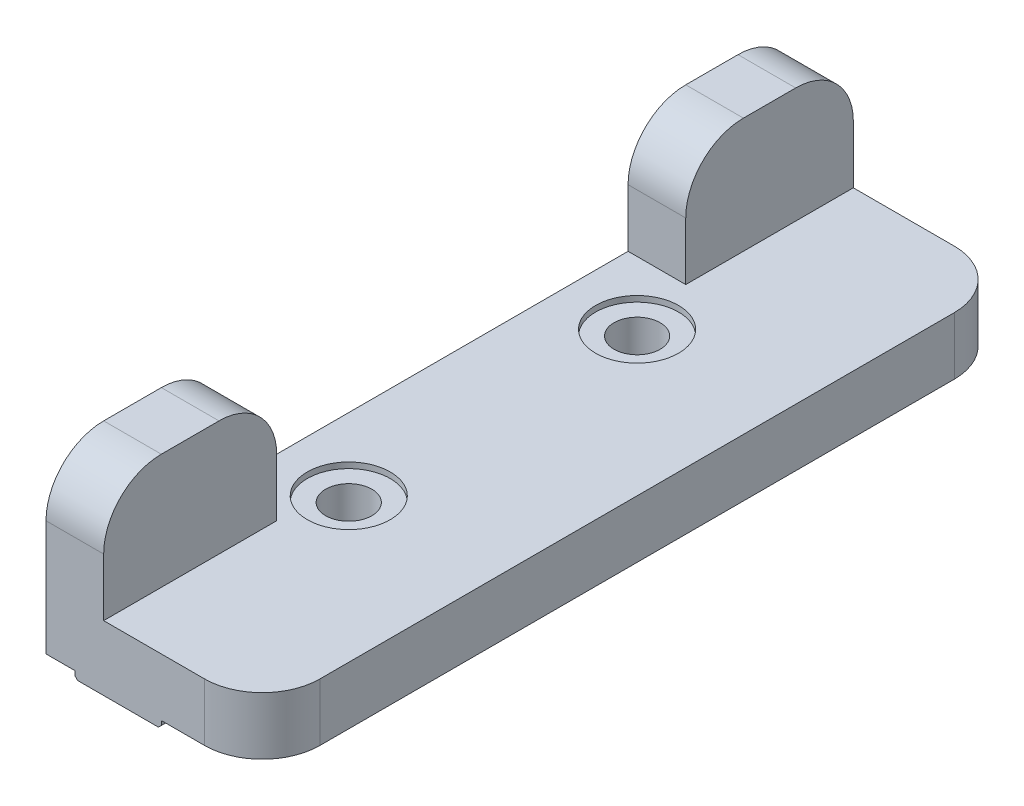
ISO-10303-21;
HEADER;
FILE_DESCRIPTION(('STEP AP214'),'2;1');
FILE_NAME('part.step','',(''),(''),'','','');
FILE_SCHEMA(('AUTOMOTIVE_DESIGN { 1 0 10303 214 1 1 1 1 }'));
ENDSEC;
DATA;
#1=APPLICATION_CONTEXT('core data for automotive mechanical design processes');
#2=APPLICATION_PROTOCOL_DEFINITION('international standard','automotive_design',2000,#1);
#3=PRODUCT_CONTEXT('',#1,'mechanical');
#4=PRODUCT('Part','Part','',(#3));
#5=PRODUCT_RELATED_PRODUCT_CATEGORY('part','',(#4));
#6=PRODUCT_DEFINITION_FORMATION('','',#4);
#7=PRODUCT_DEFINITION_CONTEXT('part definition',#1,'design');
#8=PRODUCT_DEFINITION('design','',#6,#7);
#9=PRODUCT_DEFINITION_SHAPE('','',#8);
#10=(LENGTH_UNIT() NAMED_UNIT(*) SI_UNIT(.MILLI.,.METRE.));
#11=(NAMED_UNIT(*) PLANE_ANGLE_UNIT() SI_UNIT($,.RADIAN.));
#12=(NAMED_UNIT(*) SI_UNIT($,.STERADIAN.) SOLID_ANGLE_UNIT());
#13=UNCERTAINTY_MEASURE_WITH_UNIT(LENGTH_MEASURE(1.E-05),#10,'distance_accuracy_value','');
#14=(GEOMETRIC_REPRESENTATION_CONTEXT(3) GLOBAL_UNCERTAINTY_ASSIGNED_CONTEXT((#13)) GLOBAL_UNIT_ASSIGNED_CONTEXT((#10,
#11,#12)) REPRESENTATION_CONTEXT('',''));
#15=CARTESIAN_POINT('',(0.,0.,0.));
#16=DIRECTION('',(0.,0.,1.));
#17=DIRECTION('',(1.,0.,0.));
#18=AXIS2_PLACEMENT_3D('',#15,#16,#17);
#19=CARTESIAN_POINT('',(0.,12.,52.));
#20=DIRECTION('',(0.,-1.,0.));
#21=DIRECTION('',(0.,0.,-1.));
#22=AXIS2_PLACEMENT_3D('',#19,#20,#21);
#23=PLANE('',#22);
#24=DIRECTION('',(0.,0.,-1.));
#25=VECTOR('',#24,1.);
#26=CARTESIAN_POINT('',(0.,12.,52.));
#27=LINE('',#26,#25);
#28=CARTESIAN_POINT('',(0.,12.,7.62547738644464));
#29=VERTEX_POINT('',#28);
#30=CARTESIAN_POINT('',(0.,12.,4.00000000000001));
#31=VERTEX_POINT('',#30);
#32=EDGE_CURVE('E344',#29,#31,#27,.T.);
#33=ORIENTED_EDGE('',*,*,#32,.F.);
#34=DIRECTION('',(1.,0.,0.));
#35=VECTOR('',#34,1.);
#36=CARTESIAN_POINT('',(0.,12.,7.62547738644462));
#37=LINE('',#36,#35);
#38=CARTESIAN_POINT('',(4.,12.,7.62547738644464));
#39=VERTEX_POINT('',#38);
#40=EDGE_CURVE('E280',#29,#39,#37,.T.);
#41=ORIENTED_EDGE('',*,*,#40,.T.);
#42=DIRECTION('',(0.,0.,-1.));
#43=VECTOR('',#42,1.);
#44=CARTESIAN_POINT('',(4.,12.,52.));
#45=LINE('',#44,#43);
#46=CARTESIAN_POINT('',(4.,12.,4.00000000000001));
#47=VERTEX_POINT('',#46);
#48=EDGE_CURVE('E227',#39,#47,#45,.T.);
#49=ORIENTED_EDGE('',*,*,#48,.T.);
#50=DIRECTION('',(-1.,0.,0.));
#51=VECTOR('',#50,1.);
#52=CARTESIAN_POINT('',(0.,12.,4.));
#53=LINE('',#52,#51);
#54=EDGE_CURVE('E277',#47,#31,#53,.T.);
#55=ORIENTED_EDGE('',*,*,#54,.T.);
#56=EDGE_LOOP('',(#33,#41,#49,#55));
#57=FACE_BOUND('',#56,.T.);
#58=ADVANCED_FACE('F39',(#57),#23,.F.);
#59=CARTESIAN_POINT('',(5.,12.001,16.));
#60=DIRECTION('',(0.,-1.,0.));
#61=DIRECTION('',(0.,0.,-1.));
#62=AXIS2_PLACEMENT_3D('',#59,#60,#61);
#63=CYLINDRICAL_SURFACE('',#62,1.6);
#64=CARTESIAN_POINT('',(5.,-0.5,16.));
#65=DIRECTION('',(0.,-1.,0.));
#66=DIRECTION('',(0.,0.,1.));
#67=AXIS2_PLACEMENT_3D('',#64,#65,#66);
#68=CIRCLE('',#67,1.6);
#69=CARTESIAN_POINT('',(5.,-0.5,17.6));
#70=VERTEX_POINT('',#69);
#71=EDGE_CURVE('E257',#70,#70,#68,.T.);
#72=ORIENTED_EDGE('',*,*,#71,.T.);
#73=EDGE_LOOP('',(#72));
#74=FACE_BOUND('',#73,.T.);
#75=CARTESIAN_POINT('',(5.,3.6,16.));
#76=DIRECTION('',(0.,1.,0.));
#77=DIRECTION('',(0.,0.,1.));
#78=AXIS2_PLACEMENT_3D('',#75,#76,#77);
#79=CIRCLE('',#78,1.6);
#80=CARTESIAN_POINT('',(5.,3.6,17.6));
#81=VERTEX_POINT('',#80);
#82=EDGE_CURVE('E253',#81,#81,#79,.F.);
#83=ORIENTED_EDGE('',*,*,#82,.F.);
#84=EDGE_LOOP('',(#83));
#85=FACE_BOUND('',#84,.T.);
#86=ADVANCED_FACE('F464',(#74,#85),#63,.F.);
#87=CARTESIAN_POINT('',(5.,12.001,36.));
#88=DIRECTION('',(0.,-1.,0.));
#89=DIRECTION('',(0.,0.,-1.));
#90=AXIS2_PLACEMENT_3D('',#87,#88,#89);
#91=CYLINDRICAL_SURFACE('',#90,1.59999999999999);
#92=CARTESIAN_POINT('',(5.,-0.5,36.));
#93=DIRECTION('',(0.,-1.,0.));
#94=DIRECTION('',(0.,0.,-1.));
#95=AXIS2_PLACEMENT_3D('',#92,#93,#94);
#96=CIRCLE('',#95,1.59999999999999);
#97=CARTESIAN_POINT('',(5.,-0.5,34.4));
#98=VERTEX_POINT('',#97);
#99=EDGE_CURVE('E401',#98,#98,#96,.T.);
#100=ORIENTED_EDGE('',*,*,#99,.T.);
#101=EDGE_LOOP('',(#100));
#102=FACE_BOUND('',#101,.T.);
#103=CARTESIAN_POINT('',(5.,3.6,36.));
#104=DIRECTION('',(0.,1.,0.));
#105=DIRECTION('',(0.,0.,1.));
#106=AXIS2_PLACEMENT_3D('',#103,#104,#105);
#107=CIRCLE('',#106,1.59999999999999);
#108=CARTESIAN_POINT('',(5.,3.6,37.6));
#109=VERTEX_POINT('',#108);
#110=EDGE_CURVE('E250',#109,#109,#107,.F.);
#111=ORIENTED_EDGE('',*,*,#110,.F.);
#112=EDGE_LOOP('',(#111));
#113=FACE_BOUND('',#112,.T.);
#114=ADVANCED_FACE('F470',(#102,#113),#91,.F.);
#115=CARTESIAN_POINT('',(4.,4.,52.));
#116=DIRECTION('',(-1.,0.,0.));
#117=DIRECTION('',(0.,0.,1.));
#118=AXIS2_PLACEMENT_3D('',#115,#116,#117);
#119=PLANE('',#118);
#120=ORIENTED_EDGE('',*,*,#48,.F.);
#121=CARTESIAN_POINT('',(4.,8.,7.62547738644462));
#122=DIRECTION('',(-1.,0.,0.));
#123=DIRECTION('',(0.,0.,1.));
#124=AXIS2_PLACEMENT_3D('',#121,#122,#123);
#125=CIRCLE('',#124,4.);
#126=CARTESIAN_POINT('',(4.,8.,11.6254773864446));
#127=VERTEX_POINT('',#126);
#128=EDGE_CURVE('E285',#39,#127,#125,.F.);
#129=ORIENTED_EDGE('',*,*,#128,.T.);
#130=DIRECTION('',(0.,1.,0.));
#131=VECTOR('',#130,1.);
#132=CARTESIAN_POINT('',(4.,4.,11.6254773864446));
#133=LINE('',#132,#131);
#134=CARTESIAN_POINT('',(4.,4.,11.6254773864446));
#135=VERTEX_POINT('',#134);
#136=EDGE_CURVE('E199',#135,#127,#133,.T.);
#137=ORIENTED_EDGE('',*,*,#136,.F.);
#138=DIRECTION('',(0.,0.,-1.));
#139=VECTOR('',#138,1.);
#140=CARTESIAN_POINT('',(4.,4.,52.));
#141=LINE('',#140,#139);
#142=CARTESIAN_POINT('',(4.,4.,0.));
#143=VERTEX_POINT('',#142);
#144=EDGE_CURVE('E219',#135,#143,#141,.T.);
#145=ORIENTED_EDGE('',*,*,#144,.T.);
#146=DIRECTION('',(0.,1.,0.));
#147=VECTOR('',#146,1.);
#148=CARTESIAN_POINT('',(4.,4.,0.));
#149=LINE('',#148,#147);
#150=CARTESIAN_POINT('',(4.,8.,0.));
#151=VERTEX_POINT('',#150);
#152=EDGE_CURVE('E332',#143,#151,#149,.T.);
#153=ORIENTED_EDGE('',*,*,#152,.T.);
#154=CARTESIAN_POINT('',(4.,8.,4.));
#155=DIRECTION('',(-1.,0.,0.));
#156=DIRECTION('',(0.,0.,1.));
#157=AXIS2_PLACEMENT_3D('',#154,#155,#156);
#158=CIRCLE('',#157,4.);
#159=EDGE_CURVE('E283',#151,#47,#158,.F.);
#160=ORIENTED_EDGE('',*,*,#159,.T.);
#161=EDGE_LOOP('',(#120,#129,#137,#145,#153,#160));
#162=FACE_BOUND('',#161,.T.);
#163=ADVANCED_FACE('F369',(#162),#119,.F.);
#164=CARTESIAN_POINT('',(0.,0.,52.));
#165=DIRECTION('',(0.,1.,0.));
#166=DIRECTION('',(0.,0.,1.));
#167=AXIS2_PLACEMENT_3D('',#164,#165,#166);
#168=PLANE('',#167);
#169=DIRECTION('',(0.,0.,-1.));
#170=VECTOR('',#169,1.);
#171=CARTESIAN_POINT('',(15.,0.,52.));
#172=LINE('',#171,#170);
#173=CARTESIAN_POINT('',(15.,0.,48.));
#174=VERTEX_POINT('',#173);
#175=CARTESIAN_POINT('',(15.,0.,4.00000000000001));
#176=VERTEX_POINT('',#175);
#177=EDGE_CURVE('E222',#174,#176,#172,.T.);
#178=ORIENTED_EDGE('',*,*,#177,.F.);
#179=CARTESIAN_POINT('',(11.,0.,48.));
#180=DIRECTION('',(0.,1.,0.));
#181=DIRECTION('',(0.,0.,1.));
#182=AXIS2_PLACEMENT_3D('',#179,#180,#181);
#183=CIRCLE('',#182,4.);
#184=CARTESIAN_POINT('',(11.,0.,52.));
#185=VERTEX_POINT('',#184);
#186=EDGE_CURVE('E47',#174,#185,#183,.F.);
#187=ORIENTED_EDGE('',*,*,#186,.T.);
#188=DIRECTION('',(1.,0.,0.));
#189=VECTOR('',#188,1.);
#190=CARTESIAN_POINT('',(0.,0.,52.));
#191=LINE('',#190,#189);
#192=CARTESIAN_POINT('',(8.,0.,52.));
#193=VERTEX_POINT('',#192);
#194=EDGE_CURVE('E308',#193,#185,#191,.T.);
#195=ORIENTED_EDGE('',*,*,#194,.F.);
#196=DIRECTION('',(0.,0.,1.));
#197=VECTOR('',#196,1.);
#198=CARTESIAN_POINT('',(8.,0.,52.));
#199=LINE('',#198,#197);
#200=CARTESIAN_POINT('',(8.,0.,0.));
#201=VERTEX_POINT('',#200);
#202=EDGE_CURVE('E404',#201,#193,#199,.T.);
#203=ORIENTED_EDGE('',*,*,#202,.F.);
#204=DIRECTION('',(1.,0.,0.));
#205=VECTOR('',#204,1.);
#206=CARTESIAN_POINT('',(0.,0.,0.));
#207=LINE('',#206,#205);
#208=CARTESIAN_POINT('',(11.,0.,0.));
#209=VERTEX_POINT('',#208);
#210=EDGE_CURVE('E337',#201,#209,#207,.T.);
#211=ORIENTED_EDGE('',*,*,#210,.T.);
#212=CARTESIAN_POINT('',(11.,0.,4.));
#213=DIRECTION('',(0.,1.,0.));
#214=DIRECTION('',(0.,0.,1.));
#215=AXIS2_PLACEMENT_3D('',#212,#213,#214);
#216=CIRCLE('',#215,4.);
#217=EDGE_CURVE('E59',#209,#176,#216,.F.);
#218=ORIENTED_EDGE('',*,*,#217,.T.);
#219=EDGE_LOOP('',(#178,#187,#195,#203,#211,#218));
#220=FACE_BOUND('',#219,.T.);
#221=ADVANCED_FACE('F306',(#220),#168,.F.);
#222=DIRECTION('',(0.,0.,-1.));
#223=VECTOR('',#222,1.);
#224=CARTESIAN_POINT('',(2.,0.,52.));
#225=LINE('',#224,#223);
#226=CARTESIAN_POINT('',(2.,0.,52.));
#227=VERTEX_POINT('',#226);
#228=CARTESIAN_POINT('',(2.00000000000001,0.,0.));
#229=VERTEX_POINT('',#228);
#230=EDGE_CURVE('E411',#227,#229,#225,.T.);
#231=ORIENTED_EDGE('',*,*,#230,.F.);
#232=CARTESIAN_POINT('',(0.,0.,52.));
#233=VERTEX_POINT('',#232);
#234=EDGE_CURVE('E317',#233,#227,#191,.T.);
#235=ORIENTED_EDGE('',*,*,#234,.F.);
#236=DIRECTION('',(0.,0.,-1.));
#237=VECTOR('',#236,1.);
#238=CARTESIAN_POINT('',(0.,0.,52.));
#239=LINE('',#238,#237);
#240=CARTESIAN_POINT('',(0.,0.,0.));
#241=VERTEX_POINT('',#240);
#242=EDGE_CURVE('E342',#233,#241,#239,.T.);
#243=ORIENTED_EDGE('',*,*,#242,.T.);
#244=EDGE_CURVE('E333',#241,#229,#207,.T.);
#245=ORIENTED_EDGE('',*,*,#244,.T.);
#246=EDGE_LOOP('',(#231,#235,#243,#245));
#247=FACE_BOUND('',#246,.T.);
#248=ADVANCED_FACE('F433',(#247),#168,.F.);
#249=CARTESIAN_POINT('',(15.,0.,52.));
#250=DIRECTION('',(-1.,0.,0.));
#251=DIRECTION('',(0.,0.,1.));
#252=AXIS2_PLACEMENT_3D('',#249,#250,#251);
#253=PLANE('',#252);
#254=DIRECTION('',(0.,0.,-1.));
#255=VECTOR('',#254,1.);
#256=CARTESIAN_POINT('',(15.,4.,52.));
#257=LINE('',#256,#255);
#258=CARTESIAN_POINT('',(15.,4.,48.));
#259=VERTEX_POINT('',#258);
#260=CARTESIAN_POINT('',(15.,4.,4.00000000000001));
#261=VERTEX_POINT('',#260);
#262=EDGE_CURVE('E218',#259,#261,#257,.T.);
#263=ORIENTED_EDGE('',*,*,#262,.F.);
#264=DIRECTION('',(0.,1.,0.));
#265=VECTOR('',#264,1.);
#266=CARTESIAN_POINT('',(15.,0.,48.));
#267=LINE('',#266,#265);
#268=EDGE_CURVE('E301',#259,#174,#267,.F.);
#269=ORIENTED_EDGE('',*,*,#268,.T.);
#270=ORIENTED_EDGE('',*,*,#177,.T.);
#271=DIRECTION('',(0.,1.,0.));
#272=VECTOR('',#271,1.);
#273=CARTESIAN_POINT('',(15.,0.,4.));
#274=LINE('',#273,#272);
#275=EDGE_CURVE('E298',#176,#261,#274,.T.);
#276=ORIENTED_EDGE('',*,*,#275,.T.);
#277=EDGE_LOOP('',(#263,#269,#270,#276));
#278=FACE_BOUND('',#277,.T.);
#279=ADVANCED_FACE('F324',(#278),#253,.F.);
#280=CARTESIAN_POINT('',(4.,4.,52.));
#281=DIRECTION('',(0.,-1.,0.));
#282=DIRECTION('',(0.,0.,-1.));
#283=AXIS2_PLACEMENT_3D('',#280,#281,#282);
#284=PLANE('',#283);
#285=CARTESIAN_POINT('',(5.,4.,16.));
#286=DIRECTION('',(0.,1.,0.));
#287=DIRECTION('',(0.,0.,1.));
#288=AXIS2_PLACEMENT_3D('',#285,#286,#287);
#289=CIRCLE('',#288,2.875);
#290=CARTESIAN_POINT('',(5.,4.,18.875));
#291=VERTEX_POINT('',#290);
#292=EDGE_CURVE('E396',#291,#291,#289,.T.);
#293=ORIENTED_EDGE('',*,*,#292,.F.);
#294=EDGE_LOOP('',(#293));
#295=FACE_BOUND('',#294,.T.);
#296=DIRECTION('',(-1.,0.,0.));
#297=VECTOR('',#296,1.);
#298=CARTESIAN_POINT('',(4.,4.,52.));
#299=LINE('',#298,#297);
#300=CARTESIAN_POINT('',(11.,4.,52.));
#301=VERTEX_POINT('',#300);
#302=CARTESIAN_POINT('',(4.,4.,52.));
#303=VERTEX_POINT('',#302);
#304=EDGE_CURVE('E322',#301,#303,#299,.T.);
#305=ORIENTED_EDGE('',*,*,#304,.F.);
#306=CARTESIAN_POINT('',(11.,4.,48.));
#307=DIRECTION('',(0.,-1.,0.));
#308=DIRECTION('',(0.,0.,-1.));
#309=AXIS2_PLACEMENT_3D('',#306,#307,#308);
#310=CIRCLE('',#309,4.);
#311=EDGE_CURVE('E296',#301,#259,#310,.F.);
#312=ORIENTED_EDGE('',*,*,#311,.T.);
#313=ORIENTED_EDGE('',*,*,#262,.T.);
#314=CARTESIAN_POINT('',(11.,4.,4.));
#315=DIRECTION('',(0.,-1.,0.));
#316=DIRECTION('',(0.,0.,-1.));
#317=AXIS2_PLACEMENT_3D('',#314,#315,#316);
#318=CIRCLE('',#317,4.);
#319=CARTESIAN_POINT('',(11.,4.,0.));
#320=VERTEX_POINT('',#319);
#321=EDGE_CURVE('E294',#261,#320,#318,.F.);
#322=ORIENTED_EDGE('',*,*,#321,.T.);
#323=DIRECTION('',(-1.,0.,0.));
#324=VECTOR('',#323,1.);
#325=CARTESIAN_POINT('',(4.,4.,0.));
#326=LINE('',#325,#324);
#327=EDGE_CURVE('E328',#320,#143,#326,.T.);
#328=ORIENTED_EDGE('',*,*,#327,.T.);
#329=ORIENTED_EDGE('',*,*,#144,.F.);
#330=DIRECTION('',(1.,0.,0.));
#331=VECTOR('',#330,1.);
#332=CARTESIAN_POINT('',(-0.00100000000000013,4.,11.6254773864446));
#333=LINE('',#332,#331);
#334=CARTESIAN_POINT('',(0.,4.,11.6254773864446));
#335=VERTEX_POINT('',#334);
#336=EDGE_CURVE('E212',#335,#135,#333,.T.);
#337=ORIENTED_EDGE('',*,*,#336,.F.);
#338=DIRECTION('',(0.,0.,1.));
#339=VECTOR('',#338,1.);
#340=CARTESIAN_POINT('',(0.,4.,11.6254773864446));
#341=LINE('',#340,#339);
#342=CARTESIAN_POINT('',(0.,4.,40.));
#343=VERTEX_POINT('',#342);
#344=EDGE_CURVE('E210',#335,#343,#341,.T.);
#345=ORIENTED_EDGE('',*,*,#344,.T.);
#346=DIRECTION('',(1.,0.,0.));
#347=VECTOR('',#346,1.);
#348=CARTESIAN_POINT('',(-0.00100000000000013,4.,40.));
#349=LINE('',#348,#347);
#350=CARTESIAN_POINT('',(4.,4.,40.));
#351=VERTEX_POINT('',#350);
#352=EDGE_CURVE('E193',#343,#351,#349,.T.);
#353=ORIENTED_EDGE('',*,*,#352,.T.);
#354=EDGE_CURVE('E206',#303,#351,#141,.T.);
#355=ORIENTED_EDGE('',*,*,#354,.F.);
#356=EDGE_LOOP('',(#305,#312,#313,#322,#328,#329,#337,#345,#353,#355));
#357=FACE_BOUND('',#356,.T.);
#358=CARTESIAN_POINT('',(5.,4.,36.));
#359=DIRECTION('',(0.,1.,0.));
#360=DIRECTION('',(0.,0.,1.));
#361=AXIS2_PLACEMENT_3D('',#358,#359,#360);
#362=CIRCLE('',#361,2.87500000000001);
#363=CARTESIAN_POINT('',(5.,4.,38.875));
#364=VERTEX_POINT('',#363);
#365=EDGE_CURVE('E393',#364,#364,#362,.T.);
#366=ORIENTED_EDGE('',*,*,#365,.F.);
#367=EDGE_LOOP('',(#366));
#368=FACE_BOUND('',#367,.T.);
#369=ADVANCED_FACE('F204',(#295,#357,#368),#284,.F.);
#370=CARTESIAN_POINT('',(4.,12.,48.));
#371=VERTEX_POINT('',#370);
#372=CARTESIAN_POINT('',(4.,12.,44.));
#373=VERTEX_POINT('',#372);
#374=EDGE_CURVE('E225',#371,#373,#45,.T.);
#375=ORIENTED_EDGE('',*,*,#374,.F.);
#376=CARTESIAN_POINT('',(4.,8.,48.));
#377=DIRECTION('',(-1.,0.,0.));
#378=DIRECTION('',(0.,0.,1.));
#379=AXIS2_PLACEMENT_3D('',#376,#377,#378);
#380=CIRCLE('',#379,4.);
#381=CARTESIAN_POINT('',(4.,8.,52.));
#382=VERTEX_POINT('',#381);
#383=EDGE_CURVE('E274',#371,#382,#380,.F.);
#384=ORIENTED_EDGE('',*,*,#383,.T.);
#385=DIRECTION('',(0.,1.,0.));
#386=VECTOR('',#385,1.);
#387=CARTESIAN_POINT('',(4.,4.,52.));
#388=LINE('',#387,#386);
#389=EDGE_CURVE('E217',#303,#382,#388,.T.);
#390=ORIENTED_EDGE('',*,*,#389,.F.);
#391=ORIENTED_EDGE('',*,*,#354,.T.);
#392=DIRECTION('',(0.,-1.,0.));
#393=VECTOR('',#392,1.);
#394=CARTESIAN_POINT('',(4.,4.,40.));
#395=LINE('',#394,#393);
#396=CARTESIAN_POINT('',(4.,8.,40.));
#397=VERTEX_POINT('',#396);
#398=EDGE_CURVE('E189',#397,#351,#395,.T.);
#399=ORIENTED_EDGE('',*,*,#398,.F.);
#400=CARTESIAN_POINT('',(4.,8.,44.));
#401=DIRECTION('',(-1.,0.,0.));
#402=DIRECTION('',(0.,0.,1.));
#403=AXIS2_PLACEMENT_3D('',#400,#401,#402);
#404=CIRCLE('',#403,4.);
#405=EDGE_CURVE('E272',#397,#373,#404,.F.);
#406=ORIENTED_EDGE('',*,*,#405,.T.);
#407=EDGE_LOOP('',(#375,#384,#390,#391,#399,#406));
#408=FACE_BOUND('',#407,.T.);
#409=ADVANCED_FACE('F215',(#408),#119,.F.);
#410=CARTESIAN_POINT('',(0.,12.,48.));
#411=VERTEX_POINT('',#410);
#412=CARTESIAN_POINT('',(0.,12.,44.));
#413=VERTEX_POINT('',#412);
#414=EDGE_CURVE('E346',#411,#413,#27,.T.);
#415=ORIENTED_EDGE('',*,*,#414,.F.);
#416=DIRECTION('',(-1.,0.,0.));
#417=VECTOR('',#416,1.);
#418=CARTESIAN_POINT('',(4.,12.,48.));
#419=LINE('',#418,#417);
#420=EDGE_CURVE('E270',#411,#371,#419,.F.);
#421=ORIENTED_EDGE('',*,*,#420,.T.);
#422=ORIENTED_EDGE('',*,*,#374,.T.);
#423=DIRECTION('',(1.,0.,0.));
#424=VECTOR('',#423,1.);
#425=CARTESIAN_POINT('',(0.,12.,44.));
#426=LINE('',#425,#424);
#427=EDGE_CURVE('E268',#373,#413,#426,.F.);
#428=ORIENTED_EDGE('',*,*,#427,.T.);
#429=EDGE_LOOP('',(#415,#421,#422,#428));
#430=FACE_BOUND('',#429,.T.);
#431=ADVANCED_FACE('F466',(#430),#23,.F.);
#432=CARTESIAN_POINT('',(0.,0.,52.));
#433=DIRECTION('',(1.,0.,0.));
#434=DIRECTION('',(0.,0.,-1.));
#435=AXIS2_PLACEMENT_3D('',#432,#433,#434);
#436=PLANE('',#435);
#437=CARTESIAN_POINT('',(0.,6.,6.));
#438=DIRECTION('',(-1.,0.,0.));
#439=DIRECTION('',(0.,0.,1.));
#440=AXIS2_PLACEMENT_3D('',#437,#438,#439);
#441=CIRCLE('',#440,3.);
#442=CARTESIAN_POINT('',(0.,6.,9.));
#443=VERTEX_POINT('',#442);
#444=EDGE_CURVE('E383',#443,#443,#441,.T.);
#445=ORIENTED_EDGE('',*,*,#444,.F.);
#446=EDGE_LOOP('',(#445));
#447=FACE_BOUND('',#446,.T.);
#448=CARTESIAN_POINT('',(0.,6.00000000000001,46.));
#449=DIRECTION('',(-1.,0.,0.));
#450=DIRECTION('',(0.,0.,-1.));
#451=AXIS2_PLACEMENT_3D('',#448,#449,#450);
#452=CIRCLE('',#451,3.);
#453=CARTESIAN_POINT('',(0.,6.00000000000001,43.));
#454=VERTEX_POINT('',#453);
#455=EDGE_CURVE('E377',#454,#454,#452,.T.);
#456=ORIENTED_EDGE('',*,*,#455,.F.);
#457=EDGE_LOOP('',(#456));
#458=FACE_BOUND('',#457,.T.);
#459=DIRECTION('',(0.,-1.,0.));
#460=VECTOR('',#459,1.);
#461=CARTESIAN_POINT('',(0.,0.,52.));
#462=LINE('',#461,#460);
#463=CARTESIAN_POINT('',(0.,8.,52.));
#464=VERTEX_POINT('',#463);
#465=EDGE_CURVE('E345',#464,#233,#462,.T.);
#466=ORIENTED_EDGE('',*,*,#465,.F.);
#467=CARTESIAN_POINT('',(0.,8.,48.));
#468=DIRECTION('',(1.,0.,0.));
#469=DIRECTION('',(0.,0.,-1.));
#470=AXIS2_PLACEMENT_3D('',#467,#468,#469);
#471=CIRCLE('',#470,4.);
#472=EDGE_CURVE('E266',#464,#411,#471,.F.);
#473=ORIENTED_EDGE('',*,*,#472,.T.);
#474=ORIENTED_EDGE('',*,*,#414,.T.);
#475=CARTESIAN_POINT('',(0.,8.,44.));
#476=DIRECTION('',(1.,0.,0.));
#477=DIRECTION('',(0.,0.,-1.));
#478=AXIS2_PLACEMENT_3D('',#475,#476,#477);
#479=CIRCLE('',#478,4.);
#480=CARTESIAN_POINT('',(0.,8.,40.));
#481=VERTEX_POINT('',#480);
#482=EDGE_CURVE('E264',#413,#481,#479,.F.);
#483=ORIENTED_EDGE('',*,*,#482,.T.);
#484=DIRECTION('',(0.,1.,0.));
#485=VECTOR('',#484,1.);
#486=CARTESIAN_POINT('',(0.,4.,40.));
#487=LINE('',#486,#485);
#488=EDGE_CURVE('E490',#343,#481,#487,.T.);
#489=ORIENTED_EDGE('',*,*,#488,.F.);
#490=ORIENTED_EDGE('',*,*,#344,.F.);
#491=DIRECTION('',(0.,-1.,0.));
#492=VECTOR('',#491,1.);
#493=CARTESIAN_POINT('',(0.,4.,11.6254773864446));
#494=LINE('',#493,#492);
#495=CARTESIAN_POINT('',(0.,8.,11.6254773864446));
#496=VERTEX_POINT('',#495);
#497=EDGE_CURVE('E372',#496,#335,#494,.T.);
#498=ORIENTED_EDGE('',*,*,#497,.F.);
#499=CARTESIAN_POINT('',(0.,8.,7.62547738644462));
#500=DIRECTION('',(1.,0.,0.));
#501=DIRECTION('',(0.,0.,-1.));
#502=AXIS2_PLACEMENT_3D('',#499,#500,#501);
#503=CIRCLE('',#502,4.);
#504=EDGE_CURVE('E262',#496,#29,#503,.F.);
#505=ORIENTED_EDGE('',*,*,#504,.T.);
#506=ORIENTED_EDGE('',*,*,#32,.T.);
#507=CARTESIAN_POINT('',(0.,8.,4.));
#508=DIRECTION('',(1.,0.,0.));
#509=DIRECTION('',(0.,0.,-1.));
#510=AXIS2_PLACEMENT_3D('',#507,#508,#509);
#511=CIRCLE('',#510,4.);
#512=CARTESIAN_POINT('',(0.,8.,0.));
#513=VERTEX_POINT('',#512);
#514=EDGE_CURVE('E260',#31,#513,#511,.F.);
#515=ORIENTED_EDGE('',*,*,#514,.T.);
#516=DIRECTION('',(0.,-1.,0.));
#517=VECTOR('',#516,1.);
#518=CARTESIAN_POINT('',(0.,0.,0.));
#519=LINE('',#518,#517);
#520=EDGE_CURVE('E318',#513,#241,#519,.T.);
#521=ORIENTED_EDGE('',*,*,#520,.T.);
#522=ORIENTED_EDGE('',*,*,#242,.F.);
#523=EDGE_LOOP('',(#466,#473,#474,#483,#489,#490,#498,#505,#506,#515,#521,#522));
#524=FACE_BOUND('',#523,.T.);
#525=ADVANCED_FACE('F355',(#447,#458,#524),#436,.F.);
#526=CARTESIAN_POINT('',(0.,0.,52.));
#527=DIRECTION('',(0.,0.,1.));
#528=DIRECTION('',(1.,0.,0.));
#529=AXIS2_PLACEMENT_3D('',#526,#527,#528);
#530=PLANE('',#529);
#531=ORIENTED_EDGE('',*,*,#194,.T.);
#532=DIRECTION('',(0.,1.,0.));
#533=VECTOR('',#532,1.);
#534=CARTESIAN_POINT('',(11.,4.,52.));
#535=LINE('',#534,#533);
#536=EDGE_CURVE('E291',#185,#301,#535,.T.);
#537=ORIENTED_EDGE('',*,*,#536,.T.);
#538=ORIENTED_EDGE('',*,*,#304,.T.);
#539=ORIENTED_EDGE('',*,*,#389,.T.);
#540=DIRECTION('',(-1.,0.,0.));
#541=VECTOR('',#540,1.);
#542=CARTESIAN_POINT('',(0.,8.,52.));
#543=LINE('',#542,#541);
#544=EDGE_CURVE('E249',#382,#464,#543,.T.);
#545=ORIENTED_EDGE('',*,*,#544,.T.);
#546=ORIENTED_EDGE('',*,*,#465,.T.);
#547=ORIENTED_EDGE('',*,*,#234,.T.);
#548=DIRECTION('',(0.,1.,0.));
#549=VECTOR('',#548,1.);
#550=CARTESIAN_POINT('',(2.,-0.5,52.));
#551=LINE('',#550,#549);
#552=CARTESIAN_POINT('',(2.,-0.3,52.));
#553=VERTEX_POINT('',#552);
#554=EDGE_CURVE('E421',#553,#227,#551,.T.);
#555=ORIENTED_EDGE('',*,*,#554,.F.);
#556=DIRECTION('',(-0.707106781186548,0.707106781186547,0.));
#557=VECTOR('',#556,1.);
#558=CARTESIAN_POINT('',(0.849999999999999,0.85,52.));
#559=LINE('',#558,#557);
#560=CARTESIAN_POINT('',(2.2,-0.5,52.));
#561=VERTEX_POINT('',#560);
#562=EDGE_CURVE('E245',#553,#561,#559,.F.);
#563=ORIENTED_EDGE('',*,*,#562,.T.);
#564=DIRECTION('',(-1.,0.,0.));
#565=VECTOR('',#564,1.);
#566=CARTESIAN_POINT('',(8.,-0.5,52.));
#567=LINE('',#566,#565);
#568=CARTESIAN_POINT('',(7.8,-0.5,52.));
#569=VERTEX_POINT('',#568);
#570=EDGE_CURVE('E407',#569,#561,#567,.T.);
#571=ORIENTED_EDGE('',*,*,#570,.F.);
#572=DIRECTION('',(-0.707106781186547,-0.707106781186548,0.));
#573=VECTOR('',#572,1.);
#574=CARTESIAN_POINT('',(4.15000000000001,-4.15,52.));
#575=LINE('',#574,#573);
#576=CARTESIAN_POINT('',(8.,-0.3,52.));
#577=VERTEX_POINT('',#576);
#578=EDGE_CURVE('E243',#569,#577,#575,.F.);
#579=ORIENTED_EDGE('',*,*,#578,.T.);
#580=DIRECTION('',(0.,1.,0.));
#581=VECTOR('',#580,1.);
#582=CARTESIAN_POINT('',(8.,-0.5,52.));
#583=LINE('',#582,#581);
#584=EDGE_CURVE('E316',#577,#193,#583,.T.);
#585=ORIENTED_EDGE('',*,*,#584,.T.);
#586=EDGE_LOOP('',(#531,#537,#538,#539,#545,#546,#547,#555,#563,#571,#579,#585));
#587=FACE_BOUND('',#586,.T.);
#588=ADVANCED_FACE('F314',(#587),#530,.T.);
#589=CARTESIAN_POINT('',(0.,0.,0.));
#590=DIRECTION('',(0.,0.,1.));
#591=DIRECTION('',(1.,0.,0.));
#592=AXIS2_PLACEMENT_3D('',#589,#590,#591);
#593=PLANE('',#592);
#594=ORIENTED_EDGE('',*,*,#327,.F.);
#595=DIRECTION('',(0.,1.,0.));
#596=VECTOR('',#595,1.);
#597=CARTESIAN_POINT('',(11.,0.,0.));
#598=LINE('',#597,#596);
#599=EDGE_CURVE('E13',#320,#209,#598,.F.);
#600=ORIENTED_EDGE('',*,*,#599,.T.);
#601=ORIENTED_EDGE('',*,*,#210,.F.);
#602=DIRECTION('',(0.,1.,0.));
#603=VECTOR('',#602,1.);
#604=CARTESIAN_POINT('',(8.00000000000001,-0.5,0.));
#605=LINE('',#604,#603);
#606=CARTESIAN_POINT('',(8.00000000000001,-0.3,0.));
#607=VERTEX_POINT('',#606);
#608=EDGE_CURVE('E414',#607,#201,#605,.T.);
#609=ORIENTED_EDGE('',*,*,#608,.F.);
#610=DIRECTION('',(0.707106781186547,0.707106781186548,0.));
#611=VECTOR('',#610,1.);
#612=CARTESIAN_POINT('',(7.80000000000001,-0.5,0.));
#613=LINE('',#612,#611);
#614=CARTESIAN_POINT('',(7.80000000000001,-0.5,0.));
#615=VERTEX_POINT('',#614);
#616=EDGE_CURVE('E237',#607,#615,#613,.F.);
#617=ORIENTED_EDGE('',*,*,#616,.T.);
#618=DIRECTION('',(1.,0.,0.));
#619=VECTOR('',#618,1.);
#620=CARTESIAN_POINT('',(8.00000000000001,-0.5,0.));
#621=LINE('',#620,#619);
#622=CARTESIAN_POINT('',(2.20000000000001,-0.5,0.));
#623=VERTEX_POINT('',#622);
#624=EDGE_CURVE('E410',#623,#615,#621,.T.);
#625=ORIENTED_EDGE('',*,*,#624,.F.);
#626=DIRECTION('',(0.707106781186548,-0.707106781186547,0.));
#627=VECTOR('',#626,1.);
#628=CARTESIAN_POINT('',(2.20000000000001,-0.5,0.));
#629=LINE('',#628,#627);
#630=CARTESIAN_POINT('',(2.00000000000001,-0.3,0.));
#631=VERTEX_POINT('',#630);
#632=EDGE_CURVE('E239',#623,#631,#629,.F.);
#633=ORIENTED_EDGE('',*,*,#632,.T.);
#634=DIRECTION('',(0.,1.,0.));
#635=VECTOR('',#634,1.);
#636=CARTESIAN_POINT('',(2.00000000000001,-0.5,0.));
#637=LINE('',#636,#635);
#638=EDGE_CURVE('E419',#631,#229,#637,.T.);
#639=ORIENTED_EDGE('',*,*,#638,.T.);
#640=ORIENTED_EDGE('',*,*,#244,.F.);
#641=ORIENTED_EDGE('',*,*,#520,.F.);
#642=DIRECTION('',(-1.,0.,0.));
#643=VECTOR('',#642,1.);
#644=CARTESIAN_POINT('',(0.,8.,0.));
#645=LINE('',#644,#643);
#646=EDGE_CURVE('E289',#513,#151,#645,.F.);
#647=ORIENTED_EDGE('',*,*,#646,.T.);
#648=ORIENTED_EDGE('',*,*,#152,.F.);
#649=EDGE_LOOP('',(#594,#600,#601,#609,#617,#625,#633,#639,#640,#641,#647,#648));
#650=FACE_BOUND('',#649,.T.);
#651=ADVANCED_FACE('F330',(#650),#593,.F.);
#652=CARTESIAN_POINT('',(8.,-0.5,52.));
#653=DIRECTION('',(-1.,0.,0.));
#654=DIRECTION('',(0.,0.,1.));
#655=AXIS2_PLACEMENT_3D('',#652,#653,#654);
#656=PLANE('',#655);
#657=ORIENTED_EDGE('',*,*,#584,.F.);
#658=DIRECTION('',(0.,0.,-1.));
#659=VECTOR('',#658,1.);
#660=CARTESIAN_POINT('',(8.,-0.3,52.));
#661=LINE('',#660,#659);
#662=EDGE_CURVE('E247',#577,#607,#661,.T.);
#663=ORIENTED_EDGE('',*,*,#662,.T.);
#664=ORIENTED_EDGE('',*,*,#608,.T.);
#665=ORIENTED_EDGE('',*,*,#202,.T.);
#666=EDGE_LOOP('',(#657,#663,#664,#665));
#667=FACE_BOUND('',#666,.T.);
#668=ADVANCED_FACE('F453',(#667),#656,.F.);
#669=CARTESIAN_POINT('',(2.,-0.5,52.));
#670=DIRECTION('',(1.,0.,0.));
#671=DIRECTION('',(0.,0.,-1.));
#672=AXIS2_PLACEMENT_3D('',#669,#670,#671);
#673=PLANE('',#672);
#674=ORIENTED_EDGE('',*,*,#638,.F.);
#675=DIRECTION('',(0.,0.,1.));
#676=VECTOR('',#675,1.);
#677=CARTESIAN_POINT('',(2.,-0.3,52.));
#678=LINE('',#677,#676);
#679=EDGE_CURVE('E241',#631,#553,#678,.T.);
#680=ORIENTED_EDGE('',*,*,#679,.T.);
#681=ORIENTED_EDGE('',*,*,#554,.T.);
#682=ORIENTED_EDGE('',*,*,#230,.T.);
#683=EDGE_LOOP('',(#674,#680,#681,#682));
#684=FACE_BOUND('',#683,.T.);
#685=ADVANCED_FACE('F436',(#684),#673,.F.);
#686=CARTESIAN_POINT('',(0.,-0.5,0.));
#687=DIRECTION('',(0.,1.,0.));
#688=DIRECTION('',(0.,0.,1.));
#689=AXIS2_PLACEMENT_3D('',#686,#687,#688);
#690=PLANE('',#689);
#691=ORIENTED_EDGE('',*,*,#99,.F.);
#692=EDGE_LOOP('',(#691));
#693=FACE_BOUND('',#692,.T.);
#694=ORIENTED_EDGE('',*,*,#71,.F.);
#695=EDGE_LOOP('',(#694));
#696=FACE_BOUND('',#695,.T.);
#697=ORIENTED_EDGE('',*,*,#570,.T.);
#698=DIRECTION('',(0.,0.,-1.));
#699=VECTOR('',#698,1.);
#700=CARTESIAN_POINT('',(2.20000000000001,-0.5,0.));
#701=LINE('',#700,#699);
#702=EDGE_CURVE('E234',#561,#623,#701,.T.);
#703=ORIENTED_EDGE('',*,*,#702,.T.);
#704=ORIENTED_EDGE('',*,*,#624,.T.);
#705=DIRECTION('',(0.,0.,1.));
#706=VECTOR('',#705,1.);
#707=CARTESIAN_POINT('',(7.80000000000001,-0.5,0.));
#708=LINE('',#707,#706);
#709=EDGE_CURVE('E231',#615,#569,#708,.T.);
#710=ORIENTED_EDGE('',*,*,#709,.T.);
#711=EDGE_LOOP('',(#697,#703,#704,#710));
#712=FACE_BOUND('',#711,.T.);
#713=ADVANCED_FACE('F445',(#693,#696,#712),#690,.F.);
#714=CARTESIAN_POINT('',(2.20000000000001,-0.5,0.));
#715=DIRECTION('',(0.707106781186547,0.707106781186548,0.));
#716=DIRECTION('',(0.,0.,-1.));
#717=AXIS2_PLACEMENT_3D('',#714,#715,#716);
#718=PLANE('',#717);
#719=ORIENTED_EDGE('',*,*,#562,.F.);
#720=ORIENTED_EDGE('',*,*,#679,.F.);
#721=ORIENTED_EDGE('',*,*,#632,.F.);
#722=ORIENTED_EDGE('',*,*,#702,.F.);
#723=EDGE_LOOP('',(#719,#720,#721,#722));
#724=FACE_BOUND('',#723,.T.);
#725=ADVANCED_FACE('F442',(#724),#718,.F.);
#726=CARTESIAN_POINT('',(7.80000000000001,-0.5,0.));
#727=DIRECTION('',(-0.707106781186548,0.707106781186547,0.));
#728=DIRECTION('',(0.,0.,1.));
#729=AXIS2_PLACEMENT_3D('',#726,#727,#728);
#730=PLANE('',#729);
#731=ORIENTED_EDGE('',*,*,#616,.F.);
#732=ORIENTED_EDGE('',*,*,#662,.F.);
#733=ORIENTED_EDGE('',*,*,#578,.F.);
#734=ORIENTED_EDGE('',*,*,#709,.F.);
#735=EDGE_LOOP('',(#731,#732,#733,#734));
#736=FACE_BOUND('',#735,.T.);
#737=ADVANCED_FACE('F451',(#736),#730,.F.);
#738=CARTESIAN_POINT('',(5.,3.6,36.));
#739=DIRECTION('',(0.,1.,0.));
#740=DIRECTION('',(0.,0.,1.));
#741=AXIS2_PLACEMENT_3D('',#738,#739,#740);
#742=PLANE('',#741);
#743=CARTESIAN_POINT('',(5.,3.6,36.));
#744=DIRECTION('',(0.,1.,0.));
#745=DIRECTION('',(0.,0.,1.));
#746=AXIS2_PLACEMENT_3D('',#743,#744,#745);
#747=CIRCLE('',#746,2.87500000000001);
#748=CARTESIAN_POINT('',(5.,3.6,38.875));
#749=VERTEX_POINT('',#748);
#750=EDGE_CURVE('E254',#749,#749,#747,.T.);
#751=ORIENTED_EDGE('',*,*,#750,.T.);
#752=EDGE_LOOP('',(#751));
#753=FACE_BOUND('',#752,.T.);
#754=ORIENTED_EDGE('',*,*,#110,.T.);
#755=EDGE_LOOP('',(#754));
#756=FACE_BOUND('',#755,.T.);
#757=ADVANCED_FACE('F514',(#753,#756),#742,.T.);
#758=CARTESIAN_POINT('',(5.,3.6,36.));
#759=DIRECTION('',(0.,1.,0.));
#760=DIRECTION('',(0.,0.,1.));
#761=AXIS2_PLACEMENT_3D('',#758,#759,#760);
#762=CYLINDRICAL_SURFACE('',#761,2.87500000000001);
#763=ORIENTED_EDGE('',*,*,#750,.F.);
#764=EDGE_LOOP('',(#763));
#765=FACE_BOUND('',#764,.T.);
#766=ORIENTED_EDGE('',*,*,#365,.T.);
#767=EDGE_LOOP('',(#766));
#768=FACE_BOUND('',#767,.T.);
#769=ADVANCED_FACE('F542',(#765,#768),#762,.F.);
#770=CARTESIAN_POINT('',(5.,3.6,16.));
#771=DIRECTION('',(0.,1.,0.));
#772=DIRECTION('',(0.,0.,1.));
#773=AXIS2_PLACEMENT_3D('',#770,#771,#772);
#774=PLANE('',#773);
#775=CARTESIAN_POINT('',(5.,3.6,16.));
#776=DIRECTION('',(0.,1.,0.));
#777=DIRECTION('',(0.,0.,1.));
#778=AXIS2_PLACEMENT_3D('',#775,#776,#777);
#779=CIRCLE('',#778,2.875);
#780=CARTESIAN_POINT('',(5.,3.6,18.875));
#781=VERTEX_POINT('',#780);
#782=EDGE_CURVE('E382',#781,#781,#779,.T.);
#783=ORIENTED_EDGE('',*,*,#782,.T.);
#784=EDGE_LOOP('',(#783));
#785=FACE_BOUND('',#784,.T.);
#786=ORIENTED_EDGE('',*,*,#82,.T.);
#787=EDGE_LOOP('',(#786));
#788=FACE_BOUND('',#787,.T.);
#789=ADVANCED_FACE('F532',(#785,#788),#774,.T.);
#790=CARTESIAN_POINT('',(5.,3.6,16.));
#791=DIRECTION('',(0.,1.,0.));
#792=DIRECTION('',(0.,0.,1.));
#793=AXIS2_PLACEMENT_3D('',#790,#791,#792);
#794=CYLINDRICAL_SURFACE('',#793,2.875);
#795=ORIENTED_EDGE('',*,*,#782,.F.);
#796=EDGE_LOOP('',(#795));
#797=FACE_BOUND('',#796,.T.);
#798=ORIENTED_EDGE('',*,*,#292,.T.);
#799=EDGE_LOOP('',(#798));
#800=FACE_BOUND('',#799,.T.);
#801=ADVANCED_FACE('F529',(#797,#800),#794,.F.);
#802=CARTESIAN_POINT('',(3.,6.00000000000001,46.));
#803=DIRECTION('',(-1.,0.,0.));
#804=DIRECTION('',(0.,0.,1.));
#805=AXIS2_PLACEMENT_3D('',#802,#803,#804);
#806=CYLINDRICAL_SURFACE('',#805,3.);
#807=CARTESIAN_POINT('',(3.,6.00000000000001,46.));
#808=DIRECTION('',(-1.,0.,0.));
#809=DIRECTION('',(0.,0.,-1.));
#810=AXIS2_PLACEMENT_3D('',#807,#808,#809);
#811=CIRCLE('',#810,3.);
#812=CARTESIAN_POINT('',(3.,6.00000000000001,43.));
#813=VERTEX_POINT('',#812);
#814=EDGE_CURVE('E386',#813,#813,#811,.T.);
#815=ORIENTED_EDGE('',*,*,#814,.F.);
#816=EDGE_LOOP('',(#815));
#817=FACE_BOUND('',#816,.T.);
#818=ORIENTED_EDGE('',*,*,#455,.T.);
#819=EDGE_LOOP('',(#818));
#820=FACE_BOUND('',#819,.T.);
#821=ADVANCED_FACE('F531',(#817,#820),#806,.F.);
#822=CARTESIAN_POINT('',(3.,6.00000000000001,46.));
#823=DIRECTION('',(1.,0.,0.));
#824=DIRECTION('',(0.,0.,-1.));
#825=AXIS2_PLACEMENT_3D('',#822,#823,#824);
#826=PLANE('',#825);
#827=ORIENTED_EDGE('',*,*,#814,.T.);
#828=EDGE_LOOP('',(#827));
#829=FACE_BOUND('',#828,.T.);
#830=ADVANCED_FACE('F539',(#829),#826,.F.);
#831=CARTESIAN_POINT('',(3.,6.,6.));
#832=DIRECTION('',(-1.,0.,0.));
#833=DIRECTION('',(0.,0.,1.));
#834=AXIS2_PLACEMENT_3D('',#831,#832,#833);
#835=CYLINDRICAL_SURFACE('',#834,3.);
#836=CARTESIAN_POINT('',(3.,6.,6.));
#837=DIRECTION('',(-1.,0.,0.));
#838=DIRECTION('',(0.,0.,1.));
#839=AXIS2_PLACEMENT_3D('',#836,#837,#838);
#840=CIRCLE('',#839,3.);
#841=CARTESIAN_POINT('',(3.,6.,9.));
#842=VERTEX_POINT('',#841);
#843=EDGE_CURVE('E379',#842,#842,#840,.T.);
#844=ORIENTED_EDGE('',*,*,#843,.F.);
#845=EDGE_LOOP('',(#844));
#846=FACE_BOUND('',#845,.T.);
#847=ORIENTED_EDGE('',*,*,#444,.T.);
#848=EDGE_LOOP('',(#847));
#849=FACE_BOUND('',#848,.T.);
#850=ADVANCED_FACE('F574',(#846,#849),#835,.F.);
#851=CARTESIAN_POINT('',(3.,6.,6.));
#852=DIRECTION('',(-1.,0.,0.));
#853=DIRECTION('',(0.,0.,1.));
#854=AXIS2_PLACEMENT_3D('',#851,#852,#853);
#855=PLANE('',#854);
#856=ORIENTED_EDGE('',*,*,#843,.T.);
#857=EDGE_LOOP('',(#856));
#858=FACE_BOUND('',#857,.T.);
#859=ADVANCED_FACE('F578',(#858),#855,.T.);
#860=CARTESIAN_POINT('',(-0.00100000000000013,4.,11.6254773864446));
#861=DIRECTION('',(0.,0.,-1.));
#862=DIRECTION('',(-1.,0.,0.));
#863=AXIS2_PLACEMENT_3D('',#860,#861,#862);
#864=PLANE('',#863);
#865=ORIENTED_EDGE('',*,*,#136,.T.);
#866=DIRECTION('',(1.,0.,0.));
#867=VECTOR('',#866,1.);
#868=CARTESIAN_POINT('',(-0.00100000000000013,8.,11.6254773864446));
#869=LINE('',#868,#867);
#870=EDGE_CURVE('E287',#127,#496,#869,.F.);
#871=ORIENTED_EDGE('',*,*,#870,.T.);
#872=ORIENTED_EDGE('',*,*,#497,.T.);
#873=ORIENTED_EDGE('',*,*,#336,.T.);
#874=EDGE_LOOP('',(#865,#871,#872,#873));
#875=FACE_BOUND('',#874,.T.);
#876=ADVANCED_FACE('F371',(#875),#864,.F.);
#877=CARTESIAN_POINT('',(-0.00100000000000013,4.,40.));
#878=DIRECTION('',(0.,0.,1.));
#879=DIRECTION('',(1.,0.,0.));
#880=AXIS2_PLACEMENT_3D('',#877,#878,#879);
#881=PLANE('',#880);
#882=ORIENTED_EDGE('',*,*,#488,.T.);
#883=DIRECTION('',(1.,0.,0.));
#884=VECTOR('',#883,1.);
#885=CARTESIAN_POINT('',(-0.00100000000000013,8.,40.));
#886=LINE('',#885,#884);
#887=EDGE_CURVE('E196',#481,#397,#886,.T.);
#888=ORIENTED_EDGE('',*,*,#887,.T.);
#889=ORIENTED_EDGE('',*,*,#398,.T.);
#890=ORIENTED_EDGE('',*,*,#352,.F.);
#891=EDGE_LOOP('',(#882,#888,#889,#890));
#892=FACE_BOUND('',#891,.T.);
#893=ADVANCED_FACE('F192',(#892),#881,.F.);
#894=CARTESIAN_POINT('',(0.,8.,48.));
#895=DIRECTION('',(1.,0.,0.));
#896=DIRECTION('',(0.,0.,-1.));
#897=AXIS2_PLACEMENT_3D('',#894,#895,#896);
#898=CYLINDRICAL_SURFACE('',#897,4.);
#899=ORIENTED_EDGE('',*,*,#383,.F.);
#900=ORIENTED_EDGE('',*,*,#420,.F.);
#901=ORIENTED_EDGE('',*,*,#472,.F.);
#902=ORIENTED_EDGE('',*,*,#544,.F.);
#903=EDGE_LOOP('',(#899,#900,#901,#902));
#904=FACE_BOUND('',#903,.T.);
#905=ADVANCED_FACE('F487',(#904),#898,.T.);
#906=CARTESIAN_POINT('',(-0.00100000000000013,8.,44.));
#907=DIRECTION('',(1.,0.,0.));
#908=DIRECTION('',(0.,0.,-1.));
#909=AXIS2_PLACEMENT_3D('',#906,#907,#908);
#910=CYLINDRICAL_SURFACE('',#909,4.);
#911=ORIENTED_EDGE('',*,*,#482,.F.);
#912=ORIENTED_EDGE('',*,*,#427,.F.);
#913=ORIENTED_EDGE('',*,*,#405,.F.);
#914=ORIENTED_EDGE('',*,*,#887,.F.);
#915=EDGE_LOOP('',(#911,#912,#913,#914));
#916=FACE_BOUND('',#915,.T.);
#917=ADVANCED_FACE('F489',(#916),#910,.T.);
#918=CARTESIAN_POINT('',(0.,8.,7.62547738644462));
#919=DIRECTION('',(1.,0.,0.));
#920=DIRECTION('',(0.,0.,-1.));
#921=AXIS2_PLACEMENT_3D('',#918,#919,#920);
#922=CYLINDRICAL_SURFACE('',#921,4.);
#923=ORIENTED_EDGE('',*,*,#504,.F.);
#924=ORIENTED_EDGE('',*,*,#870,.F.);
#925=ORIENTED_EDGE('',*,*,#128,.F.);
#926=ORIENTED_EDGE('',*,*,#40,.F.);
#927=EDGE_LOOP('',(#923,#924,#925,#926));
#928=FACE_BOUND('',#927,.T.);
#929=ADVANCED_FACE('F364',(#928),#922,.T.);
#930=CARTESIAN_POINT('',(0.,8.,4.));
#931=DIRECTION('',(-1.,0.,0.));
#932=DIRECTION('',(0.,0.,1.));
#933=AXIS2_PLACEMENT_3D('',#930,#931,#932);
#934=CYLINDRICAL_SURFACE('',#933,4.);
#935=ORIENTED_EDGE('',*,*,#159,.F.);
#936=ORIENTED_EDGE('',*,*,#646,.F.);
#937=ORIENTED_EDGE('',*,*,#514,.F.);
#938=ORIENTED_EDGE('',*,*,#54,.F.);
#939=EDGE_LOOP('',(#935,#936,#937,#938));
#940=FACE_BOUND('',#939,.T.);
#941=ADVANCED_FACE('F495',(#940),#934,.T.);
#942=CARTESIAN_POINT('',(11.,0.,48.));
#943=DIRECTION('',(0.,-1.,0.));
#944=DIRECTION('',(0.,0.,-1.));
#945=AXIS2_PLACEMENT_3D('',#942,#943,#944);
#946=CYLINDRICAL_SURFACE('',#945,4.);
#947=ORIENTED_EDGE('',*,*,#186,.F.);
#948=ORIENTED_EDGE('',*,*,#268,.F.);
#949=ORIENTED_EDGE('',*,*,#311,.F.);
#950=ORIENTED_EDGE('',*,*,#536,.F.);
#951=EDGE_LOOP('',(#947,#948,#949,#950));
#952=FACE_BOUND('',#951,.T.);
#953=ADVANCED_FACE('F320',(#952),#946,.T.);
#954=CARTESIAN_POINT('',(11.,0.,4.));
#955=DIRECTION('',(0.,1.,0.));
#956=DIRECTION('',(0.,0.,1.));
#957=AXIS2_PLACEMENT_3D('',#954,#955,#956);
#958=CYLINDRICAL_SURFACE('',#957,4.);
#959=ORIENTED_EDGE('',*,*,#217,.F.);
#960=ORIENTED_EDGE('',*,*,#599,.F.);
#961=ORIENTED_EDGE('',*,*,#321,.F.);
#962=ORIENTED_EDGE('',*,*,#275,.F.);
#963=EDGE_LOOP('',(#959,#960,#961,#962));
#964=FACE_BOUND('',#963,.T.);
#965=ADVANCED_FACE('F41',(#964),#958,.T.);
#966=CLOSED_SHELL('',(#58,#86,#114,#163,#221,#248,#279,#369,#409,#431,#525,#588,#651,#668,#685,
#713,#725,#737,#757,#769,#789,#801,#821,#830,#850,#859,#876,#893,#905,#917,#929,#941,#953,#965));
#967=MANIFOLD_SOLID_BREP('B2',#966);
#968=ADVANCED_BREP_SHAPE_REPRESENTATION('',(#18,#967),#14);
#969=SHAPE_DEFINITION_REPRESENTATION(#9,#968);
ENDSEC;
END-ISO-10303-21;
